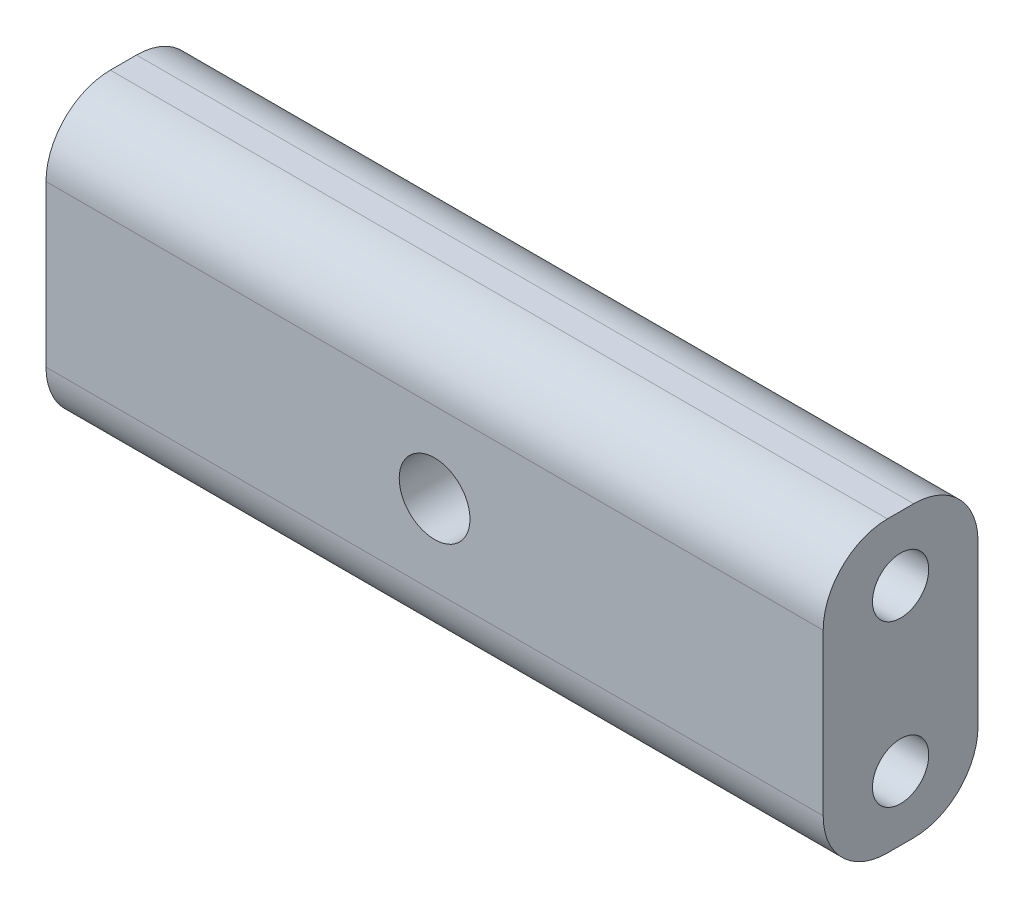
ISO-10303-21;
HEADER;
FILE_DESCRIPTION(('STEP AP214'),'2;1');
FILE_NAME('part.step','',(''),(''),'','','');
FILE_SCHEMA(('AUTOMOTIVE_DESIGN { 1 0 10303 214 1 1 1 1 }'));
ENDSEC;
DATA;
#1=APPLICATION_CONTEXT('core data for automotive mechanical design processes');
#2=APPLICATION_PROTOCOL_DEFINITION('international standard','automotive_design',2000,#1);
#3=PRODUCT_CONTEXT('',#1,'mechanical');
#4=PRODUCT('Part','Part','',(#3));
#5=PRODUCT_RELATED_PRODUCT_CATEGORY('part','',(#4));
#6=PRODUCT_DEFINITION_FORMATION('','',#4);
#7=PRODUCT_DEFINITION_CONTEXT('part definition',#1,'design');
#8=PRODUCT_DEFINITION('design','',#6,#7);
#9=PRODUCT_DEFINITION_SHAPE('','',#8);
#10=(LENGTH_UNIT() NAMED_UNIT(*) SI_UNIT(.MILLI.,.METRE.));
#11=(NAMED_UNIT(*) PLANE_ANGLE_UNIT() SI_UNIT($,.RADIAN.));
#12=(NAMED_UNIT(*) SI_UNIT($,.STERADIAN.) SOLID_ANGLE_UNIT());
#13=UNCERTAINTY_MEASURE_WITH_UNIT(LENGTH_MEASURE(1.E-05),#10,'distance_accuracy_value','');
#14=(GEOMETRIC_REPRESENTATION_CONTEXT(3) GLOBAL_UNCERTAINTY_ASSIGNED_CONTEXT((#13)) GLOBAL_UNIT_ASSIGNED_CONTEXT((#10,
#11,#12)) REPRESENTATION_CONTEXT('',''));
#15=CARTESIAN_POINT('',(0.,0.,0.));
#16=DIRECTION('',(0.,0.,1.));
#17=DIRECTION('',(1.,0.,0.));
#18=AXIS2_PLACEMENT_3D('',#15,#16,#17);
#19=CARTESIAN_POINT('',(24.17,9.,9.63));
#20=DIRECTION('',(-1.,0.,0.));
#21=DIRECTION('',(0.,0.,1.));
#22=AXIS2_PLACEMENT_3D('',#19,#20,#21);
#23=PLANE('',#22);
#24=CARTESIAN_POINT('',(24.17,-5.,4.815));
#25=DIRECTION('',(1.,0.,0.));
#26=DIRECTION('',(0.,0.,-1.));
#27=AXIS2_PLACEMENT_3D('',#24,#25,#26);
#28=CIRCLE('',#27,1.75);
#29=CARTESIAN_POINT('',(24.17,-5.,3.065));
#30=VERTEX_POINT('',#29);
#31=EDGE_CURVE('E376',#30,#30,#28,.T.);
#32=ORIENTED_EDGE('',*,*,#31,.F.);
#33=EDGE_LOOP('',(#32));
#34=FACE_BOUND('',#33,.T.);
#35=CARTESIAN_POINT('',(24.17,5.,4.815));
#36=DIRECTION('',(1.,0.,0.));
#37=DIRECTION('',(0.,0.,-1.));
#38=AXIS2_PLACEMENT_3D('',#35,#36,#37);
#39=CIRCLE('',#38,1.75);
#40=CARTESIAN_POINT('',(24.17,5.,3.065));
#41=VERTEX_POINT('',#40);
#42=EDGE_CURVE('E370',#41,#41,#39,.T.);
#43=ORIENTED_EDGE('',*,*,#42,.F.);
#44=EDGE_LOOP('',(#43));
#45=FACE_BOUND('',#44,.T.);
#46=DIRECTION('',(0.,1.,0.));
#47=VECTOR('',#46,1.);
#48=CARTESIAN_POINT('',(24.17,9.,9.63));
#49=LINE('',#48,#47);
#50=CARTESIAN_POINT('',(24.17,-5.,9.63));
#51=VERTEX_POINT('',#50);
#52=CARTESIAN_POINT('',(24.17,5.,9.63));
#53=VERTEX_POINT('',#52);
#54=EDGE_CURVE('E123',#51,#53,#49,.T.);
#55=ORIENTED_EDGE('',*,*,#54,.F.);
#56=CARTESIAN_POINT('',(24.17,-5.,5.63));
#57=DIRECTION('',(-1.,0.,0.));
#58=DIRECTION('',(0.,0.,1.));
#59=AXIS2_PLACEMENT_3D('',#56,#57,#58);
#60=CIRCLE('',#59,4.);
#61=CARTESIAN_POINT('',(24.17,-9.,5.63));
#62=VERTEX_POINT('',#61);
#63=EDGE_CURVE('E105',#51,#62,#60,.F.);
#64=ORIENTED_EDGE('',*,*,#63,.T.);
#65=DIRECTION('',(0.,0.,-1.));
#66=VECTOR('',#65,1.);
#67=CARTESIAN_POINT('',(24.17,-9.,9.63));
#68=LINE('',#67,#66);
#69=CARTESIAN_POINT('',(24.17,-9.,4.));
#70=VERTEX_POINT('',#69);
#71=EDGE_CURVE('E134',#62,#70,#68,.T.);
#72=ORIENTED_EDGE('',*,*,#71,.T.);
#73=CARTESIAN_POINT('',(24.17,-5.,4.));
#74=DIRECTION('',(-1.,0.,0.));
#75=DIRECTION('',(0.,0.,1.));
#76=AXIS2_PLACEMENT_3D('',#73,#74,#75);
#77=CIRCLE('',#76,4.);
#78=CARTESIAN_POINT('',(24.17,-5.,0.));
#79=VERTEX_POINT('',#78);
#80=EDGE_CURVE('E116',#70,#79,#77,.F.);
#81=ORIENTED_EDGE('',*,*,#80,.T.);
#82=DIRECTION('',(0.,1.,0.));
#83=VECTOR('',#82,1.);
#84=CARTESIAN_POINT('',(24.17,9.,0.));
#85=LINE('',#84,#83);
#86=CARTESIAN_POINT('',(24.17,5.,0.));
#87=VERTEX_POINT('',#86);
#88=EDGE_CURVE('E137',#79,#87,#85,.T.);
#89=ORIENTED_EDGE('',*,*,#88,.T.);
#90=CARTESIAN_POINT('',(24.17,5.,4.));
#91=DIRECTION('',(-1.,0.,0.));
#92=DIRECTION('',(0.,0.,1.));
#93=AXIS2_PLACEMENT_3D('',#90,#91,#92);
#94=CIRCLE('',#93,4.);
#95=CARTESIAN_POINT('',(24.17,9.,4.));
#96=VERTEX_POINT('',#95);
#97=EDGE_CURVE('E126',#87,#96,#94,.F.);
#98=ORIENTED_EDGE('',*,*,#97,.T.);
#99=DIRECTION('',(0.,0.,-1.));
#100=VECTOR('',#99,1.);
#101=CARTESIAN_POINT('',(24.17,9.,9.63));
#102=LINE('',#101,#100);
#103=CARTESIAN_POINT('',(24.17,9.,5.63));
#104=VERTEX_POINT('',#103);
#105=EDGE_CURVE('E152',#104,#96,#102,.T.);
#106=ORIENTED_EDGE('',*,*,#105,.F.);
#107=CARTESIAN_POINT('',(24.17,5.,5.63));
#108=DIRECTION('',(-1.,0.,0.));
#109=DIRECTION('',(0.,0.,1.));
#110=AXIS2_PLACEMENT_3D('',#107,#108,#109);
#111=CIRCLE('',#110,4.);
#112=EDGE_CURVE('E131',#104,#53,#111,.F.);
#113=ORIENTED_EDGE('',*,*,#112,.T.);
#114=EDGE_LOOP('',(#55,#64,#72,#81,#89,#98,#106,#113));
#115=FACE_BOUND('',#114,.T.);
#116=ADVANCED_FACE('F39',(#34,#45,#115),#23,.F.);
#117=CARTESIAN_POINT('',(-24.17,9.,9.63));
#118=DIRECTION('',(0.,-1.,0.));
#119=DIRECTION('',(0.,0.,-1.));
#120=AXIS2_PLACEMENT_3D('',#117,#118,#119);
#121=PLANE('',#120);
#122=DIRECTION('',(0.,0.,-1.));
#123=VECTOR('',#122,1.);
#124=CARTESIAN_POINT('',(-24.17,9.,9.63));
#125=LINE('',#124,#123);
#126=CARTESIAN_POINT('',(-24.17,9.,5.63));
#127=VERTEX_POINT('',#126);
#128=CARTESIAN_POINT('',(-24.17,9.,4.));
#129=VERTEX_POINT('',#128);
#130=EDGE_CURVE('E150',#127,#129,#125,.T.);
#131=ORIENTED_EDGE('',*,*,#130,.F.);
#132=DIRECTION('',(-1.,0.,0.));
#133=VECTOR('',#132,1.);
#134=CARTESIAN_POINT('',(24.17,9.,5.63));
#135=LINE('',#134,#133);
#136=EDGE_CURVE('E11',#127,#104,#135,.F.);
#137=ORIENTED_EDGE('',*,*,#136,.T.);
#138=ORIENTED_EDGE('',*,*,#105,.T.);
#139=DIRECTION('',(-1.,0.,0.));
#140=VECTOR('',#139,1.);
#141=CARTESIAN_POINT('',(-24.17,9.,4.));
#142=LINE('',#141,#140);
#143=EDGE_CURVE('E47',#96,#129,#142,.T.);
#144=ORIENTED_EDGE('',*,*,#143,.T.);
#145=EDGE_LOOP('',(#131,#137,#138,#144));
#146=FACE_BOUND('',#145,.T.);
#147=ADVANCED_FACE('F172',(#146),#121,.F.);
#148=CARTESIAN_POINT('',(-24.17,9.,9.63));
#149=DIRECTION('',(1.,0.,0.));
#150=DIRECTION('',(0.,0.,-1.));
#151=AXIS2_PLACEMENT_3D('',#148,#149,#150);
#152=PLANE('',#151);
#153=CARTESIAN_POINT('',(-24.17,5.,4.815));
#154=DIRECTION('',(-1.,0.,0.));
#155=DIRECTION('',(0.,0.,1.));
#156=AXIS2_PLACEMENT_3D('',#153,#154,#155);
#157=CIRCLE('',#156,1.75000000000001);
#158=CARTESIAN_POINT('',(-24.17,5.,6.56500000000001));
#159=VERTEX_POINT('',#158);
#160=EDGE_CURVE('E386',#159,#159,#157,.T.);
#161=ORIENTED_EDGE('',*,*,#160,.F.);
#162=EDGE_LOOP('',(#161));
#163=FACE_BOUND('',#162,.T.);
#164=CARTESIAN_POINT('',(-24.17,-5.,4.815));
#165=DIRECTION('',(-1.,0.,0.));
#166=DIRECTION('',(0.,0.,-1.));
#167=AXIS2_PLACEMENT_3D('',#164,#165,#166);
#168=CIRCLE('',#167,1.75000000000001);
#169=CARTESIAN_POINT('',(-24.17,-5.,3.06499999999999));
#170=VERTEX_POINT('',#169);
#171=EDGE_CURVE('E140',#170,#170,#168,.T.);
#172=ORIENTED_EDGE('',*,*,#171,.F.);
#173=EDGE_LOOP('',(#172));
#174=FACE_BOUND('',#173,.T.);
#175=DIRECTION('',(0.,0.,-1.));
#176=VECTOR('',#175,1.);
#177=CARTESIAN_POINT('',(-24.17,-9.,9.63));
#178=LINE('',#177,#176);
#179=CARTESIAN_POINT('',(-24.17,-9.,5.63));
#180=VERTEX_POINT('',#179);
#181=CARTESIAN_POINT('',(-24.17,-9.,4.));
#182=VERTEX_POINT('',#181);
#183=EDGE_CURVE('E147',#180,#182,#178,.T.);
#184=ORIENTED_EDGE('',*,*,#183,.F.);
#185=CARTESIAN_POINT('',(-24.17,-5.,5.63));
#186=DIRECTION('',(1.,0.,0.));
#187=DIRECTION('',(0.,0.,-1.));
#188=AXIS2_PLACEMENT_3D('',#185,#186,#187);
#189=CIRCLE('',#188,4.);
#190=CARTESIAN_POINT('',(-24.17,-5.,9.63));
#191=VERTEX_POINT('',#190);
#192=EDGE_CURVE('E166',#180,#191,#189,.F.);
#193=ORIENTED_EDGE('',*,*,#192,.T.);
#194=DIRECTION('',(0.,-1.,0.));
#195=VECTOR('',#194,1.);
#196=CARTESIAN_POINT('',(-24.17,9.,9.63));
#197=LINE('',#196,#195);
#198=CARTESIAN_POINT('',(-24.17,5.,9.63));
#199=VERTEX_POINT('',#198);
#200=EDGE_CURVE('E125',#199,#191,#197,.T.);
#201=ORIENTED_EDGE('',*,*,#200,.F.);
#202=CARTESIAN_POINT('',(-24.17,5.,5.63));
#203=DIRECTION('',(1.,0.,0.));
#204=DIRECTION('',(0.,0.,-1.));
#205=AXIS2_PLACEMENT_3D('',#202,#203,#204);
#206=CIRCLE('',#205,4.);
#207=EDGE_CURVE('E62',#199,#127,#206,.F.);
#208=ORIENTED_EDGE('',*,*,#207,.T.);
#209=ORIENTED_EDGE('',*,*,#130,.T.);
#210=CARTESIAN_POINT('',(-24.17,5.,4.));
#211=DIRECTION('',(1.,0.,0.));
#212=DIRECTION('',(0.,0.,-1.));
#213=AXIS2_PLACEMENT_3D('',#210,#211,#212);
#214=CIRCLE('',#213,4.);
#215=CARTESIAN_POINT('',(-24.17,5.,0.));
#216=VERTEX_POINT('',#215);
#217=EDGE_CURVE('E54',#129,#216,#214,.F.);
#218=ORIENTED_EDGE('',*,*,#217,.T.);
#219=DIRECTION('',(0.,-1.,0.));
#220=VECTOR('',#219,1.);
#221=CARTESIAN_POINT('',(-24.17,9.,0.));
#222=LINE('',#221,#220);
#223=CARTESIAN_POINT('',(-24.17,-5.,0.));
#224=VERTEX_POINT('',#223);
#225=EDGE_CURVE('E132',#216,#224,#222,.T.);
#226=ORIENTED_EDGE('',*,*,#225,.T.);
#227=CARTESIAN_POINT('',(-24.17,-5.,4.));
#228=DIRECTION('',(1.,0.,0.));
#229=DIRECTION('',(0.,0.,-1.));
#230=AXIS2_PLACEMENT_3D('',#227,#228,#229);
#231=CIRCLE('',#230,4.);
#232=EDGE_CURVE('E164',#224,#182,#231,.F.);
#233=ORIENTED_EDGE('',*,*,#232,.T.);
#234=EDGE_LOOP('',(#184,#193,#201,#208,#209,#218,#226,#233));
#235=FACE_BOUND('',#234,.T.);
#236=ADVANCED_FACE('F176',(#163,#174,#235),#152,.F.);
#237=CARTESIAN_POINT('',(-24.17,-9.,9.63));
#238=DIRECTION('',(0.,1.,0.));
#239=DIRECTION('',(0.,0.,1.));
#240=AXIS2_PLACEMENT_3D('',#237,#238,#239);
#241=PLANE('',#240);
#242=ORIENTED_EDGE('',*,*,#71,.F.);
#243=DIRECTION('',(1.,0.,0.));
#244=VECTOR('',#243,1.);
#245=CARTESIAN_POINT('',(-24.17,-9.,5.63));
#246=LINE('',#245,#244);
#247=EDGE_CURVE('E110',#62,#180,#246,.F.);
#248=ORIENTED_EDGE('',*,*,#247,.T.);
#249=ORIENTED_EDGE('',*,*,#183,.T.);
#250=DIRECTION('',(1.,0.,0.));
#251=VECTOR('',#250,1.);
#252=CARTESIAN_POINT('',(-24.17,-9.,4.));
#253=LINE('',#252,#251);
#254=EDGE_CURVE('E115',#182,#70,#253,.T.);
#255=ORIENTED_EDGE('',*,*,#254,.T.);
#256=EDGE_LOOP('',(#242,#248,#249,#255));
#257=FACE_BOUND('',#256,.T.);
#258=ADVANCED_FACE('F187',(#257),#241,.F.);
#259=CARTESIAN_POINT('',(0.,0.,9.63));
#260=DIRECTION('',(0.,0.,1.));
#261=DIRECTION('',(1.,0.,0.));
#262=AXIS2_PLACEMENT_3D('',#259,#260,#261);
#263=PLANE('',#262);
#264=CARTESIAN_POINT('',(0.,0.,9.63));
#265=DIRECTION('',(0.,0.,1.));
#266=DIRECTION('',(1.,0.,0.));
#267=AXIS2_PLACEMENT_3D('',#264,#265,#266);
#268=CIRCLE('',#267,2.2);
#269=CARTESIAN_POINT('',(2.2,0.,9.63));
#270=VERTEX_POINT('',#269);
#271=EDGE_CURVE('E367',#270,#270,#268,.F.);
#272=ORIENTED_EDGE('',*,*,#271,.T.);
#273=EDGE_LOOP('',(#272));
#274=FACE_BOUND('',#273,.T.);
#275=ORIENTED_EDGE('',*,*,#200,.T.);
#276=DIRECTION('',(1.,0.,0.));
#277=VECTOR('',#276,1.);
#278=CARTESIAN_POINT('',(24.17,-5.,9.63));
#279=LINE('',#278,#277);
#280=EDGE_CURVE('E109',#191,#51,#279,.T.);
#281=ORIENTED_EDGE('',*,*,#280,.T.);
#282=ORIENTED_EDGE('',*,*,#54,.T.);
#283=DIRECTION('',(-1.,0.,0.));
#284=VECTOR('',#283,1.);
#285=CARTESIAN_POINT('',(-24.17,5.,9.63));
#286=LINE('',#285,#284);
#287=EDGE_CURVE('E127',#53,#199,#286,.T.);
#288=ORIENTED_EDGE('',*,*,#287,.T.);
#289=EDGE_LOOP('',(#275,#281,#282,#288));
#290=FACE_BOUND('',#289,.T.);
#291=ADVANCED_FACE('F121',(#274,#290),#263,.T.);
#292=CARTESIAN_POINT('',(0.,0.,0.));
#293=DIRECTION('',(0.,0.,1.));
#294=DIRECTION('',(1.,0.,0.));
#295=AXIS2_PLACEMENT_3D('',#292,#293,#294);
#296=PLANE('',#295);
#297=CARTESIAN_POINT('',(0.,0.,0.));
#298=DIRECTION('',(0.,0.,-1.));
#299=DIRECTION('',(-1.,0.,0.));
#300=AXIS2_PLACEMENT_3D('',#297,#298,#299);
#301=CIRCLE('',#300,2.2);
#302=CARTESIAN_POINT('',(-2.2,0.,0.));
#303=VERTEX_POINT('',#302);
#304=EDGE_CURVE('E366',#303,#303,#301,.T.);
#305=ORIENTED_EDGE('',*,*,#304,.F.);
#306=EDGE_LOOP('',(#305));
#307=FACE_BOUND('',#306,.T.);
#308=ORIENTED_EDGE('',*,*,#88,.F.);
#309=DIRECTION('',(1.,0.,0.));
#310=VECTOR('',#309,1.);
#311=CARTESIAN_POINT('',(0.,-5.,0.));
#312=LINE('',#311,#310);
#313=EDGE_CURVE('E170',#79,#224,#312,.F.);
#314=ORIENTED_EDGE('',*,*,#313,.T.);
#315=ORIENTED_EDGE('',*,*,#225,.F.);
#316=DIRECTION('',(-1.,0.,0.));
#317=VECTOR('',#316,1.);
#318=CARTESIAN_POINT('',(0.,5.,0.));
#319=LINE('',#318,#317);
#320=EDGE_CURVE('E168',#216,#87,#319,.F.);
#321=ORIENTED_EDGE('',*,*,#320,.T.);
#322=EDGE_LOOP('',(#308,#314,#315,#321));
#323=FACE_BOUND('',#322,.T.);
#324=ADVANCED_FACE('F181',(#307,#323),#296,.F.);
#325=CARTESIAN_POINT('',(-16.17,-5.,4.815));
#326=DIRECTION('',(-1.,0.,0.));
#327=DIRECTION('',(0.,0.,1.));
#328=AXIS2_PLACEMENT_3D('',#325,#326,#327);
#329=CYLINDRICAL_SURFACE('',#328,1.75000000000001);
#330=CARTESIAN_POINT('',(-16.17,-5.,4.815));
#331=DIRECTION('',(-1.,0.,0.));
#332=DIRECTION('',(0.,0.,-1.));
#333=AXIS2_PLACEMENT_3D('',#330,#331,#332);
#334=CIRCLE('',#333,1.75000000000001);
#335=CARTESIAN_POINT('',(-16.17,-5.,3.06499999999999));
#336=VERTEX_POINT('',#335);
#337=EDGE_CURVE('E388',#336,#336,#334,.T.);
#338=ORIENTED_EDGE('',*,*,#337,.F.);
#339=EDGE_LOOP('',(#338));
#340=FACE_BOUND('',#339,.T.);
#341=ORIENTED_EDGE('',*,*,#171,.T.);
#342=EDGE_LOOP('',(#341));
#343=FACE_BOUND('',#342,.T.);
#344=ADVANCED_FACE('F318',(#340,#343),#329,.F.);
#345=CARTESIAN_POINT('',(-16.17,-5.,4.815));
#346=DIRECTION('',(1.,0.,0.));
#347=DIRECTION('',(0.,0.,-1.));
#348=AXIS2_PLACEMENT_3D('',#345,#346,#347);
#349=PLANE('',#348);
#350=ORIENTED_EDGE('',*,*,#337,.T.);
#351=EDGE_LOOP('',(#350));
#352=FACE_BOUND('',#351,.T.);
#353=ADVANCED_FACE('F308',(#352),#349,.F.);
#354=CARTESIAN_POINT('',(-16.17,5.,4.815));
#355=DIRECTION('',(-1.,0.,0.));
#356=DIRECTION('',(0.,0.,1.));
#357=AXIS2_PLACEMENT_3D('',#354,#355,#356);
#358=CYLINDRICAL_SURFACE('',#357,1.75000000000001);
#359=CARTESIAN_POINT('',(-16.17,5.,4.815));
#360=DIRECTION('',(-1.,0.,0.));
#361=DIRECTION('',(0.,0.,1.));
#362=AXIS2_PLACEMENT_3D('',#359,#360,#361);
#363=CIRCLE('',#362,1.75000000000001);
#364=CARTESIAN_POINT('',(-16.17,5.,6.56500000000001));
#365=VERTEX_POINT('',#364);
#366=EDGE_CURVE('E144',#365,#365,#363,.T.);
#367=ORIENTED_EDGE('',*,*,#366,.F.);
#368=EDGE_LOOP('',(#367));
#369=FACE_BOUND('',#368,.T.);
#370=ORIENTED_EDGE('',*,*,#160,.T.);
#371=EDGE_LOOP('',(#370));
#372=FACE_BOUND('',#371,.T.);
#373=ADVANCED_FACE('F298',(#369,#372),#358,.F.);
#374=CARTESIAN_POINT('',(-16.17,5.,4.815));
#375=DIRECTION('',(-1.,0.,0.));
#376=DIRECTION('',(0.,0.,1.));
#377=AXIS2_PLACEMENT_3D('',#374,#375,#376);
#378=PLANE('',#377);
#379=ORIENTED_EDGE('',*,*,#366,.T.);
#380=EDGE_LOOP('',(#379));
#381=FACE_BOUND('',#380,.T.);
#382=ADVANCED_FACE('F288',(#381),#378,.T.);
#383=CARTESIAN_POINT('',(16.17,5.,4.815));
#384=DIRECTION('',(1.,0.,0.));
#385=DIRECTION('',(0.,0.,-1.));
#386=AXIS2_PLACEMENT_3D('',#383,#384,#385);
#387=CYLINDRICAL_SURFACE('',#386,1.75);
#388=CARTESIAN_POINT('',(16.17,5.,4.815));
#389=DIRECTION('',(1.,0.,0.));
#390=DIRECTION('',(0.,0.,-1.));
#391=AXIS2_PLACEMENT_3D('',#388,#389,#390);
#392=CIRCLE('',#391,1.75);
#393=CARTESIAN_POINT('',(16.17,5.,3.065));
#394=VERTEX_POINT('',#393);
#395=EDGE_CURVE('E379',#394,#394,#392,.T.);
#396=ORIENTED_EDGE('',*,*,#395,.F.);
#397=EDGE_LOOP('',(#396));
#398=FACE_BOUND('',#397,.T.);
#399=ORIENTED_EDGE('',*,*,#42,.T.);
#400=EDGE_LOOP('',(#399));
#401=FACE_BOUND('',#400,.T.);
#402=ADVANCED_FACE('F278',(#398,#401),#387,.F.);
#403=CARTESIAN_POINT('',(16.17,5.,4.815));
#404=DIRECTION('',(1.,0.,0.));
#405=DIRECTION('',(0.,0.,-1.));
#406=AXIS2_PLACEMENT_3D('',#403,#404,#405);
#407=PLANE('',#406);
#408=ORIENTED_EDGE('',*,*,#395,.T.);
#409=EDGE_LOOP('',(#408));
#410=FACE_BOUND('',#409,.T.);
#411=ADVANCED_FACE('F268',(#410),#407,.T.);
#412=CARTESIAN_POINT('',(16.17,-5.,4.815));
#413=DIRECTION('',(1.,0.,0.));
#414=DIRECTION('',(0.,0.,-1.));
#415=AXIS2_PLACEMENT_3D('',#412,#413,#414);
#416=CYLINDRICAL_SURFACE('',#415,1.75);
#417=CARTESIAN_POINT('',(16.17,-5.,4.815));
#418=DIRECTION('',(1.,0.,0.));
#419=DIRECTION('',(0.,0.,-1.));
#420=AXIS2_PLACEMENT_3D('',#417,#418,#419);
#421=CIRCLE('',#420,1.75);
#422=CARTESIAN_POINT('',(16.17,-5.,3.065));
#423=VERTEX_POINT('',#422);
#424=EDGE_CURVE('E373',#423,#423,#421,.T.);
#425=ORIENTED_EDGE('',*,*,#424,.F.);
#426=EDGE_LOOP('',(#425));
#427=FACE_BOUND('',#426,.T.);
#428=ORIENTED_EDGE('',*,*,#31,.T.);
#429=EDGE_LOOP('',(#428));
#430=FACE_BOUND('',#429,.T.);
#431=ADVANCED_FACE('F258',(#427,#430),#416,.F.);
#432=CARTESIAN_POINT('',(16.17,-5.,4.815));
#433=DIRECTION('',(1.,0.,0.));
#434=DIRECTION('',(0.,0.,-1.));
#435=AXIS2_PLACEMENT_3D('',#432,#433,#434);
#436=PLANE('',#435);
#437=ORIENTED_EDGE('',*,*,#424,.T.);
#438=EDGE_LOOP('',(#437));
#439=FACE_BOUND('',#438,.T.);
#440=ADVANCED_FACE('F248',(#439),#436,.T.);
#441=CARTESIAN_POINT('',(0.,0.,15.8525396744416));
#442=DIRECTION('',(0.,0.,-1.));
#443=DIRECTION('',(-1.,0.,0.));
#444=AXIS2_PLACEMENT_3D('',#441,#442,#443);
#445=CYLINDRICAL_SURFACE('',#444,2.2);
#446=ORIENTED_EDGE('',*,*,#304,.T.);
#447=EDGE_LOOP('',(#446));
#448=FACE_BOUND('',#447,.T.);
#449=ORIENTED_EDGE('',*,*,#271,.F.);
#450=EDGE_LOOP('',(#449));
#451=FACE_BOUND('',#450,.T.);
#452=ADVANCED_FACE('F212',(#448,#451),#445,.F.);
#453=CARTESIAN_POINT('',(0.,-5.,5.63));
#454=DIRECTION('',(-1.,0.,0.));
#455=DIRECTION('',(0.,0.,1.));
#456=AXIS2_PLACEMENT_3D('',#453,#454,#455);
#457=CYLINDRICAL_SURFACE('',#456,4.);
#458=ORIENTED_EDGE('',*,*,#192,.F.);
#459=ORIENTED_EDGE('',*,*,#247,.F.);
#460=ORIENTED_EDGE('',*,*,#63,.F.);
#461=ORIENTED_EDGE('',*,*,#280,.F.);
#462=EDGE_LOOP('',(#458,#459,#460,#461));
#463=FACE_BOUND('',#462,.T.);
#464=ADVANCED_FACE('F108',(#463),#457,.T.);
#465=CARTESIAN_POINT('',(-24.17,-5.,4.));
#466=DIRECTION('',(1.,0.,0.));
#467=DIRECTION('',(0.,0.,-1.));
#468=AXIS2_PLACEMENT_3D('',#465,#466,#467);
#469=CYLINDRICAL_SURFACE('',#468,4.);
#470=ORIENTED_EDGE('',*,*,#232,.F.);
#471=ORIENTED_EDGE('',*,*,#313,.F.);
#472=ORIENTED_EDGE('',*,*,#80,.F.);
#473=ORIENTED_EDGE('',*,*,#254,.F.);
#474=EDGE_LOOP('',(#470,#471,#472,#473));
#475=FACE_BOUND('',#474,.T.);
#476=ADVANCED_FACE('F184',(#475),#469,.T.);
#477=CARTESIAN_POINT('',(0.,5.,5.63));
#478=DIRECTION('',(1.,0.,0.));
#479=DIRECTION('',(0.,0.,-1.));
#480=AXIS2_PLACEMENT_3D('',#477,#478,#479);
#481=CYLINDRICAL_SURFACE('',#480,4.);
#482=ORIENTED_EDGE('',*,*,#112,.F.);
#483=ORIENTED_EDGE('',*,*,#136,.F.);
#484=ORIENTED_EDGE('',*,*,#207,.F.);
#485=ORIENTED_EDGE('',*,*,#287,.F.);
#486=EDGE_LOOP('',(#482,#483,#484,#485));
#487=FACE_BOUND('',#486,.T.);
#488=ADVANCED_FACE('F214',(#487),#481,.T.);
#489=CARTESIAN_POINT('',(-24.17,5.,4.));
#490=DIRECTION('',(-1.,0.,0.));
#491=DIRECTION('',(0.,0.,1.));
#492=AXIS2_PLACEMENT_3D('',#489,#490,#491);
#493=CYLINDRICAL_SURFACE('',#492,4.);
#494=ORIENTED_EDGE('',*,*,#97,.F.);
#495=ORIENTED_EDGE('',*,*,#320,.F.);
#496=ORIENTED_EDGE('',*,*,#217,.F.);
#497=ORIENTED_EDGE('',*,*,#143,.F.);
#498=EDGE_LOOP('',(#494,#495,#496,#497));
#499=FACE_BOUND('',#498,.T.);
#500=ADVANCED_FACE('F41',(#499),#493,.T.);
#501=CLOSED_SHELL('',(#116,#147,#236,#258,#291,#324,#344,#353,#373,#382,#402,#411,#431,#440,
#452,#464,#476,#488,#500));
#502=MANIFOLD_SOLID_BREP('B2',#501);
#503=ADVANCED_BREP_SHAPE_REPRESENTATION('',(#18,#502),#14);
#504=SHAPE_DEFINITION_REPRESENTATION(#9,#503);
ENDSEC;
END-ISO-10303-21;
